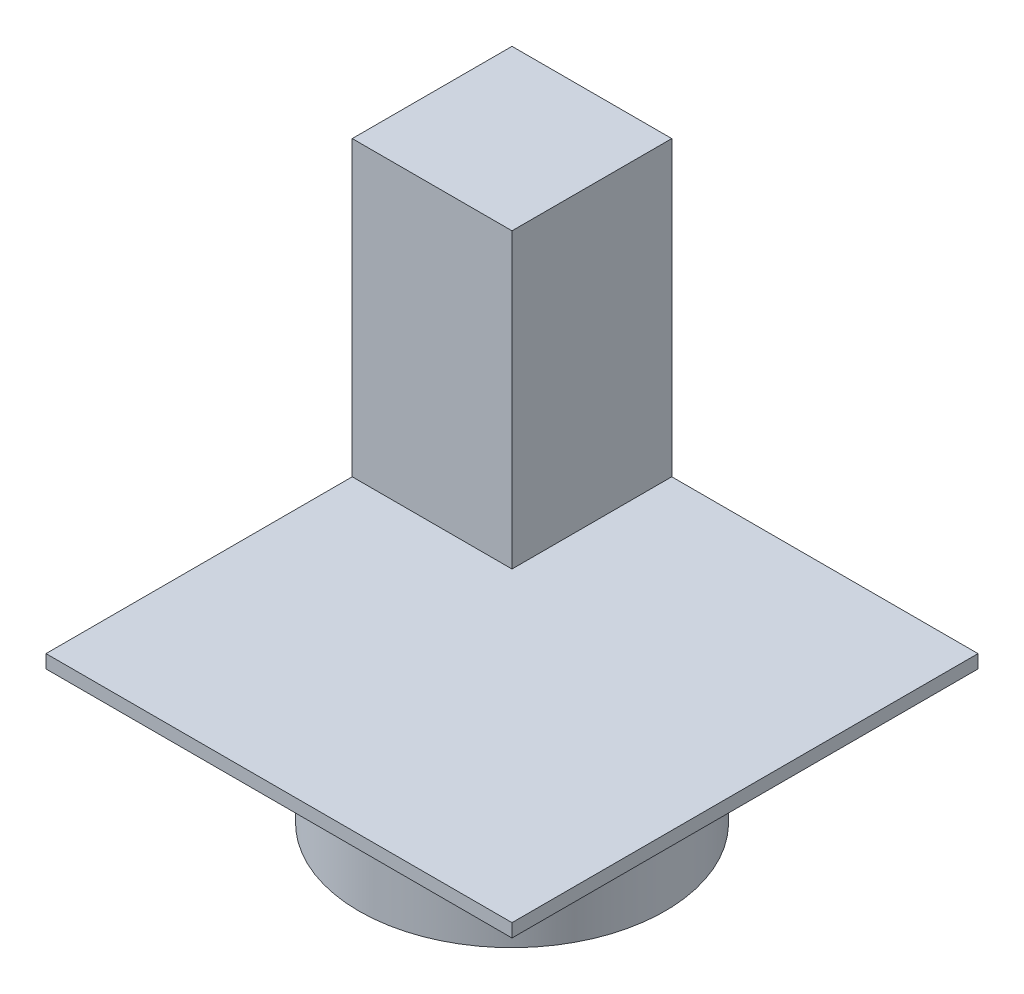
ISO-10303-21;
HEADER;
FILE_DESCRIPTION(('STEP AP214'),'2;1');
FILE_NAME('part.step','',(''),(''),'','','');
FILE_SCHEMA(('AUTOMOTIVE_DESIGN { 1 0 10303 214 1 1 1 1 }'));
ENDSEC;
DATA;
#1=APPLICATION_CONTEXT('core data for automotive mechanical design processes');
#2=APPLICATION_PROTOCOL_DEFINITION('international standard','automotive_design',2000,#1);
#3=PRODUCT_CONTEXT('',#1,'mechanical');
#4=PRODUCT('Part','Part','',(#3));
#5=PRODUCT_RELATED_PRODUCT_CATEGORY('part','',(#4));
#6=PRODUCT_DEFINITION_FORMATION('','',#4);
#7=PRODUCT_DEFINITION_CONTEXT('part definition',#1,'design');
#8=PRODUCT_DEFINITION('design','',#6,#7);
#9=PRODUCT_DEFINITION_SHAPE('','',#8);
#10=(LENGTH_UNIT() NAMED_UNIT(*) SI_UNIT(.MILLI.,.METRE.));
#11=(NAMED_UNIT(*) PLANE_ANGLE_UNIT() SI_UNIT($,.RADIAN.));
#12=(NAMED_UNIT(*) SI_UNIT($,.STERADIAN.) SOLID_ANGLE_UNIT());
#13=UNCERTAINTY_MEASURE_WITH_UNIT(LENGTH_MEASURE(1.E-05),#10,'distance_accuracy_value','');
#14=(GEOMETRIC_REPRESENTATION_CONTEXT(3) GLOBAL_UNCERTAINTY_ASSIGNED_CONTEXT((#13)) GLOBAL_UNIT_ASSIGNED_CONTEXT((#10,
#11,#12)) REPRESENTATION_CONTEXT('',''));
#15=CARTESIAN_POINT('',(0.,0.,0.));
#16=DIRECTION('',(0.,0.,1.));
#17=DIRECTION('',(1.,0.,0.));
#18=AXIS2_PLACEMENT_3D('',#15,#16,#17);
#19=CARTESIAN_POINT('',(0.,1.,0.));
#20=DIRECTION('',(0.,-1.,0.));
#21=DIRECTION('',(0.,0.,-1.));
#22=AXIS2_PLACEMENT_3D('',#19,#20,#21);
#23=PLANE('',#22);
#24=DIRECTION('',(0.,0.,-1.));
#25=VECTOR('',#24,1.);
#26=CARTESIAN_POINT('',(12.,1.,-35.));
#27=LINE('',#26,#25);
#28=CARTESIAN_POINT('',(12.,1.,-23.));
#29=VERTEX_POINT('',#28);
#30=CARTESIAN_POINT('',(12.,1.,-35.));
#31=VERTEX_POINT('',#30);
#32=EDGE_CURVE('E110',#29,#31,#27,.T.);
#33=ORIENTED_EDGE('',*,*,#32,.F.);
#34=DIRECTION('',(1.,0.,0.));
#35=VECTOR('',#34,1.);
#36=CARTESIAN_POINT('',(0.,1.,-23.));
#37=LINE('',#36,#35);
#38=CARTESIAN_POINT('',(0.,1.,-23.));
#39=VERTEX_POINT('',#38);
#40=EDGE_CURVE('E54',#39,#29,#37,.T.);
#41=ORIENTED_EDGE('',*,*,#40,.F.);
#42=DIRECTION('',(0.,0.,1.));
#43=VECTOR('',#42,1.);
#44=CARTESIAN_POINT('',(0.,1.,0.));
#45=LINE('',#44,#43);
#46=CARTESIAN_POINT('',(0.,1.,0.));
#47=VERTEX_POINT('',#46);
#48=EDGE_CURVE('E114',#39,#47,#45,.T.);
#49=ORIENTED_EDGE('',*,*,#48,.T.);
#50=DIRECTION('',(1.,0.,0.));
#51=VECTOR('',#50,1.);
#52=CARTESIAN_POINT('',(0.,1.,0.));
#53=LINE('',#52,#51);
#54=CARTESIAN_POINT('',(35.,1.,0.));
#55=VERTEX_POINT('',#54);
#56=EDGE_CURVE('E124',#47,#55,#53,.T.);
#57=ORIENTED_EDGE('',*,*,#56,.T.);
#58=DIRECTION('',(0.,0.,-1.));
#59=VECTOR('',#58,1.);
#60=CARTESIAN_POINT('',(35.,1.,0.));
#61=LINE('',#60,#59);
#62=CARTESIAN_POINT('',(35.,1.,-35.));
#63=VERTEX_POINT('',#62);
#64=EDGE_CURVE('E127',#55,#63,#61,.T.);
#65=ORIENTED_EDGE('',*,*,#64,.T.);
#66=DIRECTION('',(-1.,0.,0.));
#67=VECTOR('',#66,1.);
#68=CARTESIAN_POINT('',(0.,1.,-35.));
#69=LINE('',#68,#67);
#70=EDGE_CURVE('E48',#63,#31,#69,.T.);
#71=ORIENTED_EDGE('',*,*,#70,.T.);
#72=EDGE_LOOP('',(#33,#41,#49,#57,#65,#71));
#73=FACE_BOUND('',#72,.T.);
#74=ADVANCED_FACE('F33',(#73),#23,.F.);
#75=CARTESIAN_POINT('',(0.,1.,0.));
#76=DIRECTION('',(1.,0.,0.));
#77=DIRECTION('',(0.,0.,-1.));
#78=AXIS2_PLACEMENT_3D('',#75,#76,#77);
#79=PLANE('',#78);
#80=DIRECTION('',(0.,0.,1.));
#81=VECTOR('',#80,1.);
#82=CARTESIAN_POINT('',(0.,0.,0.));
#83=LINE('',#82,#81);
#84=CARTESIAN_POINT('',(0.,0.,-35.));
#85=VERTEX_POINT('',#84);
#86=CARTESIAN_POINT('',(0.,0.,0.));
#87=VERTEX_POINT('',#86);
#88=EDGE_CURVE('E115',#85,#87,#83,.T.);
#89=ORIENTED_EDGE('',*,*,#88,.T.);
#90=DIRECTION('',(0.,-1.,0.));
#91=VECTOR('',#90,1.);
#92=CARTESIAN_POINT('',(0.,1.,0.));
#93=LINE('',#92,#91);
#94=EDGE_CURVE('E41',#47,#87,#93,.T.);
#95=ORIENTED_EDGE('',*,*,#94,.F.);
#96=ORIENTED_EDGE('',*,*,#48,.F.);
#97=DIRECTION('',(0.,-1.,0.));
#98=VECTOR('',#97,1.);
#99=CARTESIAN_POINT('',(0.,23.,-23.));
#100=LINE('',#99,#98);
#101=CARTESIAN_POINT('',(0.,23.,-23.));
#102=VERTEX_POINT('',#101);
#103=EDGE_CURVE('E95',#102,#39,#100,.T.);
#104=ORIENTED_EDGE('',*,*,#103,.F.);
#105=DIRECTION('',(0.,0.,1.));
#106=VECTOR('',#105,1.);
#107=CARTESIAN_POINT('',(0.,23.,-35.));
#108=LINE('',#107,#106);
#109=CARTESIAN_POINT('',(0.,23.,-35.));
#110=VERTEX_POINT('',#109);
#111=EDGE_CURVE('E101',#110,#102,#108,.T.);
#112=ORIENTED_EDGE('',*,*,#111,.F.);
#113=DIRECTION('',(0.,-1.,0.));
#114=VECTOR('',#113,1.);
#115=CARTESIAN_POINT('',(0.,1.,-35.));
#116=LINE('',#115,#114);
#117=EDGE_CURVE('E129',#110,#85,#116,.T.);
#118=ORIENTED_EDGE('',*,*,#117,.T.);
#119=EDGE_LOOP('',(#89,#95,#96,#104,#112,#118));
#120=FACE_BOUND('',#119,.T.);
#121=ADVANCED_FACE('F35',(#120),#79,.F.);
#122=CARTESIAN_POINT('',(0.,1.,0.));
#123=DIRECTION('',(0.,0.,-1.));
#124=DIRECTION('',(-1.,0.,0.));
#125=AXIS2_PLACEMENT_3D('',#122,#123,#124);
#126=PLANE('',#125);
#127=DIRECTION('',(1.,0.,0.));
#128=VECTOR('',#127,1.);
#129=CARTESIAN_POINT('',(0.,0.,0.));
#130=LINE('',#129,#128);
#131=CARTESIAN_POINT('',(35.,0.,0.));
#132=VERTEX_POINT('',#131);
#133=EDGE_CURVE('E117',#87,#132,#130,.T.);
#134=ORIENTED_EDGE('',*,*,#133,.T.);
#135=DIRECTION('',(0.,-1.,0.));
#136=VECTOR('',#135,1.);
#137=CARTESIAN_POINT('',(35.,1.,0.));
#138=LINE('',#137,#136);
#139=EDGE_CURVE('E139',#55,#132,#138,.T.);
#140=ORIENTED_EDGE('',*,*,#139,.F.);
#141=ORIENTED_EDGE('',*,*,#56,.F.);
#142=ORIENTED_EDGE('',*,*,#94,.T.);
#143=EDGE_LOOP('',(#134,#140,#141,#142));
#144=FACE_BOUND('',#143,.T.);
#145=ADVANCED_FACE('F144',(#144),#126,.F.);
#146=CARTESIAN_POINT('',(35.,1.,0.));
#147=DIRECTION('',(-1.,0.,0.));
#148=DIRECTION('',(0.,0.,1.));
#149=AXIS2_PLACEMENT_3D('',#146,#147,#148);
#150=PLANE('',#149);
#151=DIRECTION('',(0.,0.,-1.));
#152=VECTOR('',#151,1.);
#153=CARTESIAN_POINT('',(35.,0.,0.));
#154=LINE('',#153,#152);
#155=CARTESIAN_POINT('',(35.,0.,-35.));
#156=VERTEX_POINT('',#155);
#157=EDGE_CURVE('E132',#132,#156,#154,.T.);
#158=ORIENTED_EDGE('',*,*,#157,.T.);
#159=DIRECTION('',(0.,-1.,0.));
#160=VECTOR('',#159,1.);
#161=CARTESIAN_POINT('',(35.,1.,-35.));
#162=LINE('',#161,#160);
#163=EDGE_CURVE('E136',#63,#156,#162,.T.);
#164=ORIENTED_EDGE('',*,*,#163,.F.);
#165=ORIENTED_EDGE('',*,*,#64,.F.);
#166=ORIENTED_EDGE('',*,*,#139,.T.);
#167=EDGE_LOOP('',(#158,#164,#165,#166));
#168=FACE_BOUND('',#167,.T.);
#169=ADVANCED_FACE('F153',(#168),#150,.F.);
#170=CARTESIAN_POINT('',(0.,1.,-35.));
#171=DIRECTION('',(0.,0.,1.));
#172=DIRECTION('',(1.,0.,0.));
#173=AXIS2_PLACEMENT_3D('',#170,#171,#172);
#174=PLANE('',#173);
#175=DIRECTION('',(-1.,0.,0.));
#176=VECTOR('',#175,1.);
#177=CARTESIAN_POINT('',(0.,0.,-35.));
#178=LINE('',#177,#176);
#179=EDGE_CURVE('E125',#156,#85,#178,.T.);
#180=ORIENTED_EDGE('',*,*,#179,.T.);
#181=ORIENTED_EDGE('',*,*,#117,.F.);
#182=DIRECTION('',(-1.,0.,0.));
#183=VECTOR('',#182,1.);
#184=CARTESIAN_POINT('',(0.,23.,-35.));
#185=LINE('',#184,#183);
#186=CARTESIAN_POINT('',(12.,23.,-35.));
#187=VERTEX_POINT('',#186);
#188=EDGE_CURVE('E107',#187,#110,#185,.T.);
#189=ORIENTED_EDGE('',*,*,#188,.F.);
#190=DIRECTION('',(0.,-1.,0.));
#191=VECTOR('',#190,1.);
#192=CARTESIAN_POINT('',(12.,23.,-35.));
#193=LINE('',#192,#191);
#194=EDGE_CURVE('E119',#187,#31,#193,.T.);
#195=ORIENTED_EDGE('',*,*,#194,.T.);
#196=ORIENTED_EDGE('',*,*,#70,.F.);
#197=ORIENTED_EDGE('',*,*,#163,.T.);
#198=EDGE_LOOP('',(#180,#181,#189,#195,#196,#197));
#199=FACE_BOUND('',#198,.T.);
#200=ADVANCED_FACE('F156',(#199),#174,.F.);
#201=CARTESIAN_POINT('',(0.,0.,0.));
#202=DIRECTION('',(0.,-1.,0.));
#203=DIRECTION('',(0.,0.,-1.));
#204=AXIS2_PLACEMENT_3D('',#201,#202,#203);
#205=PLANE('',#204);
#206=CARTESIAN_POINT('',(17.5,0.,-17.5));
#207=DIRECTION('',(0.,-1.,0.));
#208=DIRECTION('',(0.,0.,-1.));
#209=AXIS2_PLACEMENT_3D('',#206,#207,#208);
#210=CIRCLE('',#209,11.5);
#211=CARTESIAN_POINT('',(17.5,0.,-29.));
#212=VERTEX_POINT('',#211);
#213=EDGE_CURVE('E166',#212,#212,#210,.T.);
#214=ORIENTED_EDGE('',*,*,#213,.F.);
#215=EDGE_LOOP('',(#214));
#216=FACE_BOUND('',#215,.T.);
#217=ORIENTED_EDGE('',*,*,#88,.F.);
#218=ORIENTED_EDGE('',*,*,#179,.F.);
#219=ORIENTED_EDGE('',*,*,#157,.F.);
#220=ORIENTED_EDGE('',*,*,#133,.F.);
#221=EDGE_LOOP('',(#217,#218,#219,#220));
#222=FACE_BOUND('',#221,.T.);
#223=ADVANCED_FACE('F149',(#216,#222),#205,.T.);
#224=CARTESIAN_POINT('',(0.,23.,-23.));
#225=DIRECTION('',(0.,0.,-1.));
#226=DIRECTION('',(-1.,0.,0.));
#227=AXIS2_PLACEMENT_3D('',#224,#225,#226);
#228=PLANE('',#227);
#229=ORIENTED_EDGE('',*,*,#40,.T.);
#230=DIRECTION('',(0.,-1.,0.));
#231=VECTOR('',#230,1.);
#232=CARTESIAN_POINT('',(12.,23.,-23.));
#233=LINE('',#232,#231);
#234=CARTESIAN_POINT('',(12.,23.,-23.));
#235=VERTEX_POINT('',#234);
#236=EDGE_CURVE('E97',#235,#29,#233,.T.);
#237=ORIENTED_EDGE('',*,*,#236,.F.);
#238=DIRECTION('',(1.,0.,0.));
#239=VECTOR('',#238,1.);
#240=CARTESIAN_POINT('',(0.,23.,-23.));
#241=LINE('',#240,#239);
#242=EDGE_CURVE('E91',#102,#235,#241,.T.);
#243=ORIENTED_EDGE('',*,*,#242,.F.);
#244=ORIENTED_EDGE('',*,*,#103,.T.);
#245=EDGE_LOOP('',(#229,#237,#243,#244));
#246=FACE_BOUND('',#245,.T.);
#247=ADVANCED_FACE('F93',(#246),#228,.F.);
#248=CARTESIAN_POINT('',(12.,23.,-35.));
#249=DIRECTION('',(-1.,0.,0.));
#250=DIRECTION('',(0.,0.,1.));
#251=AXIS2_PLACEMENT_3D('',#248,#249,#250);
#252=PLANE('',#251);
#253=ORIENTED_EDGE('',*,*,#32,.T.);
#254=ORIENTED_EDGE('',*,*,#194,.F.);
#255=DIRECTION('',(0.,0.,-1.));
#256=VECTOR('',#255,1.);
#257=CARTESIAN_POINT('',(12.,23.,-35.));
#258=LINE('',#257,#256);
#259=EDGE_CURVE('E100',#235,#187,#258,.T.);
#260=ORIENTED_EDGE('',*,*,#259,.F.);
#261=ORIENTED_EDGE('',*,*,#236,.T.);
#262=EDGE_LOOP('',(#253,#254,#260,#261));
#263=FACE_BOUND('',#262,.T.);
#264=ADVANCED_FACE('F189',(#263),#252,.F.);
#265=CARTESIAN_POINT('',(0.,23.,0.));
#266=DIRECTION('',(0.,1.,0.));
#267=DIRECTION('',(0.,0.,1.));
#268=AXIS2_PLACEMENT_3D('',#265,#266,#267);
#269=PLANE('',#268);
#270=ORIENTED_EDGE('',*,*,#111,.T.);
#271=ORIENTED_EDGE('',*,*,#242,.T.);
#272=ORIENTED_EDGE('',*,*,#259,.T.);
#273=ORIENTED_EDGE('',*,*,#188,.T.);
#274=EDGE_LOOP('',(#270,#271,#272,#273));
#275=FACE_BOUND('',#274,.T.);
#276=ADVANCED_FACE('F105',(#275),#269,.T.);
#277=CARTESIAN_POINT('',(17.5,-10.,-17.5));
#278=DIRECTION('',(0.,-1.,0.));
#279=DIRECTION('',(0.,0.,-1.));
#280=AXIS2_PLACEMENT_3D('',#277,#278,#279);
#281=PLANE('',#280);
#282=CARTESIAN_POINT('',(17.5,-10.,-17.5));
#283=DIRECTION('',(0.,-1.,0.));
#284=DIRECTION('',(0.,0.,-1.));
#285=AXIS2_PLACEMENT_3D('',#282,#283,#284);
#286=CIRCLE('',#285,11.5);
#287=CARTESIAN_POINT('',(17.5,-10.,-29.));
#288=VERTEX_POINT('',#287);
#289=EDGE_CURVE('E163',#288,#288,#286,.T.);
#290=ORIENTED_EDGE('',*,*,#289,.T.);
#291=EDGE_LOOP('',(#290));
#292=FACE_BOUND('',#291,.T.);
#293=CARTESIAN_POINT('',(17.5,-10.,-17.5));
#294=DIRECTION('',(0.,-1.,0.));
#295=DIRECTION('',(0.,0.,-1.));
#296=AXIS2_PLACEMENT_3D('',#293,#294,#295);
#297=CIRCLE('',#296,10.25);
#298=CARTESIAN_POINT('',(17.5,-10.,-27.75));
#299=VERTEX_POINT('',#298);
#300=EDGE_CURVE('E169',#299,#299,#297,.T.);
#301=ORIENTED_EDGE('',*,*,#300,.F.);
#302=EDGE_LOOP('',(#301));
#303=FACE_BOUND('',#302,.T.);
#304=ADVANCED_FACE('F178',(#292,#303),#281,.T.);
#305=CARTESIAN_POINT('',(17.5,-10.,-17.5));
#306=DIRECTION('',(0.,1.,0.));
#307=DIRECTION('',(0.,0.,1.));
#308=AXIS2_PLACEMENT_3D('',#305,#306,#307);
#309=CYLINDRICAL_SURFACE('',#308,11.5);
#310=ORIENTED_EDGE('',*,*,#289,.F.);
#311=EDGE_LOOP('',(#310));
#312=FACE_BOUND('',#311,.T.);
#313=ORIENTED_EDGE('',*,*,#213,.T.);
#314=EDGE_LOOP('',(#313));
#315=FACE_BOUND('',#314,.T.);
#316=ADVANCED_FACE('F180',(#312,#315),#309,.T.);
#317=CARTESIAN_POINT('',(17.5,-10.,-17.5));
#318=DIRECTION('',(0.,1.,0.));
#319=DIRECTION('',(0.,0.,1.));
#320=AXIS2_PLACEMENT_3D('',#317,#318,#319);
#321=CYLINDRICAL_SURFACE('',#320,10.25);
#322=ORIENTED_EDGE('',*,*,#300,.T.);
#323=EDGE_LOOP('',(#322));
#324=FACE_BOUND('',#323,.T.);
#325=CARTESIAN_POINT('',(17.5,0.,-17.5));
#326=DIRECTION('',(0.,-1.,0.));
#327=DIRECTION('',(0.,0.,-1.));
#328=AXIS2_PLACEMENT_3D('',#325,#326,#327);
#329=CIRCLE('',#328,10.25);
#330=CARTESIAN_POINT('',(17.5,0.,-27.75));
#331=VERTEX_POINT('',#330);
#332=EDGE_CURVE('E11',#331,#331,#329,.F.);
#333=ORIENTED_EDGE('',*,*,#332,.T.);
#334=EDGE_LOOP('',(#333));
#335=FACE_BOUND('',#334,.T.);
#336=ADVANCED_FACE('F175',(#324,#335),#321,.F.);
#337=ORIENTED_EDGE('',*,*,#332,.F.);
#338=EDGE_LOOP('',(#337));
#339=FACE_BOUND('',#338,.T.);
#340=ADVANCED_FACE('F203',(#339),#205,.T.);
#341=CLOSED_SHELL('',(#74,#121,#145,#169,#200,#223,#247,#264,#276,#304,#316,#336,#340));
#342=MANIFOLD_SOLID_BREP('B2',#341);
#343=ADVANCED_BREP_SHAPE_REPRESENTATION('',(#18,#342),#14);
#344=SHAPE_DEFINITION_REPRESENTATION(#9,#343);
ENDSEC;
END-ISO-10303-21;
